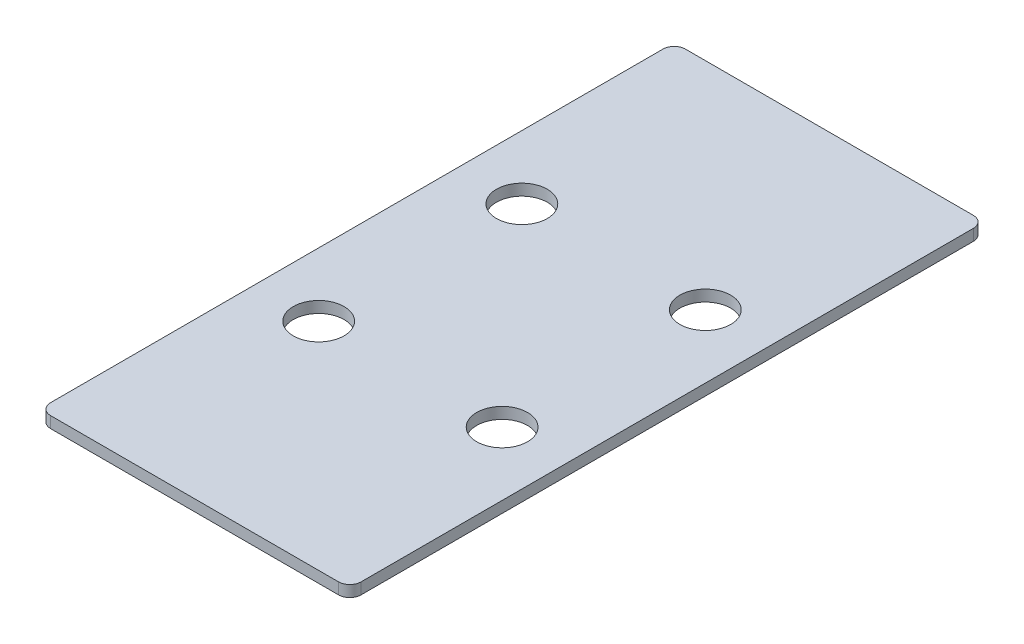
ISO-10303-21;
HEADER;
FILE_DESCRIPTION(('STEP AP214'),'2;1');
FILE_NAME('part.step','',(''),(''),'','','');
FILE_SCHEMA(('AUTOMOTIVE_DESIGN { 1 0 10303 214 1 1 1 1 }'));
ENDSEC;
DATA;
#1=APPLICATION_CONTEXT('core data for automotive mechanical design processes');
#2=APPLICATION_PROTOCOL_DEFINITION('international standard','automotive_design',2000,#1);
#3=PRODUCT_CONTEXT('',#1,'mechanical');
#4=PRODUCT('Part','Part','',(#3));
#5=PRODUCT_RELATED_PRODUCT_CATEGORY('part','',(#4));
#6=PRODUCT_DEFINITION_FORMATION('','',#4);
#7=PRODUCT_DEFINITION_CONTEXT('part definition',#1,'design');
#8=PRODUCT_DEFINITION('design','',#6,#7);
#9=PRODUCT_DEFINITION_SHAPE('','',#8);
#10=(LENGTH_UNIT() NAMED_UNIT(*) SI_UNIT(.MILLI.,.METRE.));
#11=(NAMED_UNIT(*) PLANE_ANGLE_UNIT() SI_UNIT($,.RADIAN.));
#12=(NAMED_UNIT(*) SI_UNIT($,.STERADIAN.) SOLID_ANGLE_UNIT());
#13=UNCERTAINTY_MEASURE_WITH_UNIT(LENGTH_MEASURE(1.E-05),#10,'distance_accuracy_value','');
#14=(GEOMETRIC_REPRESENTATION_CONTEXT(3) GLOBAL_UNCERTAINTY_ASSIGNED_CONTEXT((#13)) GLOBAL_UNIT_ASSIGNED_CONTEXT((#10,
#11,#12)) REPRESENTATION_CONTEXT('',''));
#15=CARTESIAN_POINT('',(0.,0.,0.));
#16=DIRECTION('',(0.,0.,1.));
#17=DIRECTION('',(1.,0.,0.));
#18=AXIS2_PLACEMENT_3D('',#15,#16,#17);
#19=CARTESIAN_POINT('',(0.,37.5,0.));
#20=DIRECTION('',(0.,-1.,0.));
#21=DIRECTION('',(0.,0.,-1.));
#22=AXIS2_PLACEMENT_3D('',#19,#20,#21);
#23=PLANE('',#22);
#24=CARTESIAN_POINT('',(-16.25,37.5,-18.));
#25=DIRECTION('',(0.,-1.,0.));
#26=DIRECTION('',(0.,0.,-1.));
#27=AXIS2_PLACEMENT_3D('',#24,#25,#26);
#28=CIRCLE('',#27,4.5);
#29=CARTESIAN_POINT('',(-16.25,37.5,-22.5));
#30=VERTEX_POINT('',#29);
#31=EDGE_CURVE('E151',#30,#30,#28,.F.);
#32=ORIENTED_EDGE('',*,*,#31,.F.);
#33=EDGE_LOOP('',(#32));
#34=FACE_BOUND('',#33,.T.);
#35=CARTESIAN_POINT('',(16.25,37.5,18.));
#36=DIRECTION('',(0.,-1.,0.));
#37=DIRECTION('',(0.,0.,-1.));
#38=AXIS2_PLACEMENT_3D('',#35,#36,#37);
#39=CIRCLE('',#38,4.5);
#40=CARTESIAN_POINT('',(16.25,37.5,13.5));
#41=VERTEX_POINT('',#40);
#42=EDGE_CURVE('E157',#41,#41,#39,.F.);
#43=ORIENTED_EDGE('',*,*,#42,.F.);
#44=EDGE_LOOP('',(#43));
#45=FACE_BOUND('',#44,.T.);
#46=DIRECTION('',(0.,0.,-1.));
#47=VECTOR('',#46,1.);
#48=CARTESIAN_POINT('',(27.5,37.5,-56.235));
#49=LINE('',#48,#47);
#50=CARTESIAN_POINT('',(27.5,37.5,54.2350000000001));
#51=VERTEX_POINT('',#50);
#52=CARTESIAN_POINT('',(27.5,37.5,-54.235));
#53=VERTEX_POINT('',#52);
#54=EDGE_CURVE('E145',#51,#53,#49,.T.);
#55=ORIENTED_EDGE('',*,*,#54,.T.);
#56=CARTESIAN_POINT('',(25.5,37.5,-54.235));
#57=DIRECTION('',(0.,-1.,0.));
#58=DIRECTION('',(0.,0.,-1.));
#59=AXIS2_PLACEMENT_3D('',#56,#57,#58);
#60=CIRCLE('',#59,2.);
#61=CARTESIAN_POINT('',(25.5,37.5,-56.235));
#62=VERTEX_POINT('',#61);
#63=EDGE_CURVE('E183',#53,#62,#60,.F.);
#64=ORIENTED_EDGE('',*,*,#63,.T.);
#65=DIRECTION('',(-1.,0.,0.));
#66=VECTOR('',#65,1.);
#67=CARTESIAN_POINT('',(27.5,37.5,-56.235));
#68=LINE('',#67,#66);
#69=CARTESIAN_POINT('',(-25.5,37.5,-56.235));
#70=VERTEX_POINT('',#69);
#71=EDGE_CURVE('E122',#62,#70,#68,.T.);
#72=ORIENTED_EDGE('',*,*,#71,.T.);
#73=CARTESIAN_POINT('',(-25.5,37.5,-54.235));
#74=DIRECTION('',(0.,-1.,0.));
#75=DIRECTION('',(0.,0.,-1.));
#76=AXIS2_PLACEMENT_3D('',#73,#74,#75);
#77=CIRCLE('',#76,2.);
#78=CARTESIAN_POINT('',(-27.5,37.5,-54.235));
#79=VERTEX_POINT('',#78);
#80=EDGE_CURVE('E181',#70,#79,#77,.F.);
#81=ORIENTED_EDGE('',*,*,#80,.T.);
#82=DIRECTION('',(0.,0.,1.));
#83=VECTOR('',#82,1.);
#84=CARTESIAN_POINT('',(-27.5,37.5,-56.235));
#85=LINE('',#84,#83);
#86=CARTESIAN_POINT('',(-27.5,37.5,54.2350000000002));
#87=VERTEX_POINT('',#86);
#88=EDGE_CURVE('E142',#79,#87,#85,.T.);
#89=ORIENTED_EDGE('',*,*,#88,.T.);
#90=CARTESIAN_POINT('',(-25.5,37.5,54.2350000000001));
#91=DIRECTION('',(0.,-1.,0.));
#92=DIRECTION('',(0.,0.,-1.));
#93=AXIS2_PLACEMENT_3D('',#90,#91,#92);
#94=CIRCLE('',#93,2.);
#95=CARTESIAN_POINT('',(-25.5,37.5,56.2350000000002));
#96=VERTEX_POINT('',#95);
#97=EDGE_CURVE('E57',#87,#96,#94,.F.);
#98=ORIENTED_EDGE('',*,*,#97,.T.);
#99=DIRECTION('',(1.,0.,0.));
#100=VECTOR('',#99,1.);
#101=CARTESIAN_POINT('',(27.5,37.5,56.2350000000001));
#102=LINE('',#101,#100);
#103=CARTESIAN_POINT('',(25.5,37.5,56.2350000000001));
#104=VERTEX_POINT('',#103);
#105=EDGE_CURVE('E139',#96,#104,#102,.T.);
#106=ORIENTED_EDGE('',*,*,#105,.T.);
#107=CARTESIAN_POINT('',(25.5,37.5,54.2350000000001));
#108=DIRECTION('',(0.,-1.,0.));
#109=DIRECTION('',(0.,0.,-1.));
#110=AXIS2_PLACEMENT_3D('',#107,#108,#109);
#111=CIRCLE('',#110,2.);
#112=EDGE_CURVE('E179',#104,#51,#111,.F.);
#113=ORIENTED_EDGE('',*,*,#112,.T.);
#114=EDGE_LOOP('',(#55,#64,#72,#81,#89,#98,#106,#113));
#115=FACE_BOUND('',#114,.T.);
#116=CARTESIAN_POINT('',(16.25,37.5,-18.));
#117=DIRECTION('',(0.,-1.,0.));
#118=DIRECTION('',(0.,0.,-1.));
#119=AXIS2_PLACEMENT_3D('',#116,#117,#118);
#120=CIRCLE('',#119,4.5);
#121=CARTESIAN_POINT('',(16.25,37.5,-22.5));
#122=VERTEX_POINT('',#121);
#123=EDGE_CURVE('E154',#122,#122,#120,.F.);
#124=ORIENTED_EDGE('',*,*,#123,.F.);
#125=EDGE_LOOP('',(#124));
#126=FACE_BOUND('',#125,.T.);
#127=CARTESIAN_POINT('',(-16.25,37.5,18.0000000000001));
#128=DIRECTION('',(0.,-1.,0.));
#129=DIRECTION('',(0.,0.,-1.));
#130=AXIS2_PLACEMENT_3D('',#127,#128,#129);
#131=CIRCLE('',#130,4.5);
#132=CARTESIAN_POINT('',(-16.25,37.5,13.5000000000001));
#133=VERTEX_POINT('',#132);
#134=EDGE_CURVE('E148',#133,#133,#131,.F.);
#135=ORIENTED_EDGE('',*,*,#134,.F.);
#136=EDGE_LOOP('',(#135));
#137=FACE_BOUND('',#136,.T.);
#138=ADVANCED_FACE('F37',(#34,#45,#115,#126,#137),#23,.F.);
#139=CARTESIAN_POINT('',(0.,35.5,0.));
#140=DIRECTION('',(0.,-1.,0.));
#141=DIRECTION('',(0.,0.,-1.));
#142=AXIS2_PLACEMENT_3D('',#139,#140,#141);
#143=PLANE('',#142);
#144=DIRECTION('',(-1.,0.,0.));
#145=VECTOR('',#144,1.);
#146=CARTESIAN_POINT('',(27.5,35.5,-56.235));
#147=LINE('',#146,#145);
#148=CARTESIAN_POINT('',(25.5,35.5,-56.235));
#149=VERTEX_POINT('',#148);
#150=CARTESIAN_POINT('',(-25.5,35.5,-56.235));
#151=VERTEX_POINT('',#150);
#152=EDGE_CURVE('E119',#149,#151,#147,.T.);
#153=ORIENTED_EDGE('',*,*,#152,.F.);
#154=CARTESIAN_POINT('',(25.5,35.5,-54.235));
#155=DIRECTION('',(0.,-1.,0.));
#156=DIRECTION('',(0.,0.,-1.));
#157=AXIS2_PLACEMENT_3D('',#154,#155,#156);
#158=CIRCLE('',#157,2.);
#159=CARTESIAN_POINT('',(27.5,35.5,-54.235));
#160=VERTEX_POINT('',#159);
#161=EDGE_CURVE('E102',#149,#160,#158,.T.);
#162=ORIENTED_EDGE('',*,*,#161,.T.);
#163=DIRECTION('',(0.,0.,-1.));
#164=VECTOR('',#163,1.);
#165=CARTESIAN_POINT('',(27.5,35.5,-56.235));
#166=LINE('',#165,#164);
#167=CARTESIAN_POINT('',(27.5,35.5,54.2350000000001));
#168=VERTEX_POINT('',#167);
#169=EDGE_CURVE('E130',#168,#160,#166,.T.);
#170=ORIENTED_EDGE('',*,*,#169,.F.);
#171=CARTESIAN_POINT('',(25.5,35.5,54.2350000000001));
#172=DIRECTION('',(0.,-1.,0.));
#173=DIRECTION('',(0.,0.,-1.));
#174=AXIS2_PLACEMENT_3D('',#171,#172,#173);
#175=CIRCLE('',#174,2.);
#176=CARTESIAN_POINT('',(25.5,35.5,56.2350000000001));
#177=VERTEX_POINT('',#176);
#178=EDGE_CURVE('E172',#168,#177,#175,.T.);
#179=ORIENTED_EDGE('',*,*,#178,.T.);
#180=DIRECTION('',(1.,0.,0.));
#181=VECTOR('',#180,1.);
#182=CARTESIAN_POINT('',(27.5,35.5,56.2350000000001));
#183=LINE('',#182,#181);
#184=CARTESIAN_POINT('',(-25.5,35.5,56.2350000000002));
#185=VERTEX_POINT('',#184);
#186=EDGE_CURVE('E133',#185,#177,#183,.T.);
#187=ORIENTED_EDGE('',*,*,#186,.F.);
#188=CARTESIAN_POINT('',(-25.5,35.5,54.2350000000001));
#189=DIRECTION('',(0.,-1.,0.));
#190=DIRECTION('',(0.,0.,-1.));
#191=AXIS2_PLACEMENT_3D('',#188,#189,#190);
#192=CIRCLE('',#191,2.);
#193=CARTESIAN_POINT('',(-27.5,35.5,54.2350000000002));
#194=VERTEX_POINT('',#193);
#195=EDGE_CURVE('E123',#185,#194,#192,.T.);
#196=ORIENTED_EDGE('',*,*,#195,.T.);
#197=DIRECTION('',(0.,0.,1.));
#198=VECTOR('',#197,1.);
#199=CARTESIAN_POINT('',(-27.5,35.5,-56.235));
#200=LINE('',#199,#198);
#201=CARTESIAN_POINT('',(-27.5,35.5,-54.235));
#202=VERTEX_POINT('',#201);
#203=EDGE_CURVE('E129',#202,#194,#200,.T.);
#204=ORIENTED_EDGE('',*,*,#203,.F.);
#205=CARTESIAN_POINT('',(-25.5,35.5,-54.235));
#206=DIRECTION('',(0.,-1.,0.));
#207=DIRECTION('',(0.,0.,-1.));
#208=AXIS2_PLACEMENT_3D('',#205,#206,#207);
#209=CIRCLE('',#208,2.);
#210=EDGE_CURVE('E113',#202,#151,#209,.T.);
#211=ORIENTED_EDGE('',*,*,#210,.T.);
#212=EDGE_LOOP('',(#153,#162,#170,#179,#187,#196,#204,#211));
#213=FACE_BOUND('',#212,.T.);
#214=CARTESIAN_POINT('',(16.25,35.5,18.));
#215=DIRECTION('',(0.,1.,0.));
#216=DIRECTION('',(0.0774921052081773,0.,-0.996992965687524));
#217=AXIS2_PLACEMENT_3D('',#214,#215,#216);
#218=CIRCLE('',#217,4.5);
#219=CARTESIAN_POINT('',(16.5987144734368,35.5,13.5135316544062));
#220=VERTEX_POINT('',#219);
#221=EDGE_CURVE('E135',#220,#220,#218,.T.);
#222=ORIENTED_EDGE('',*,*,#221,.T.);
#223=EDGE_LOOP('',(#222));
#224=FACE_BOUND('',#223,.T.);
#225=CARTESIAN_POINT('',(16.25,35.5000000000001,-18.));
#226=DIRECTION('',(0.,1.,0.));
#227=DIRECTION('',(-0.107426511793893,0.,0.994213027758034));
#228=AXIS2_PLACEMENT_3D('',#225,#226,#227);
#229=CIRCLE('',#228,4.5);
#230=CARTESIAN_POINT('',(15.7665806969275,35.5000000000001,-13.5260413750888));
#231=VERTEX_POINT('',#230);
#232=EDGE_CURVE('E162',#231,#231,#229,.T.);
#233=ORIENTED_EDGE('',*,*,#232,.T.);
#234=EDGE_LOOP('',(#233));
#235=FACE_BOUND('',#234,.T.);
#236=CARTESIAN_POINT('',(-16.25,35.5,-18.));
#237=DIRECTION('',(0.,1.,0.));
#238=DIRECTION('',(-0.446739389266582,0.,0.89466413702446));
#239=AXIS2_PLACEMENT_3D('',#236,#237,#238);
#240=CIRCLE('',#239,4.5);
#241=CARTESIAN_POINT('',(-18.2603272516996,35.5,-13.9740113833899));
#242=VERTEX_POINT('',#241);
#243=EDGE_CURVE('E163',#242,#242,#240,.T.);
#244=ORIENTED_EDGE('',*,*,#243,.T.);
#245=EDGE_LOOP('',(#244));
#246=FACE_BOUND('',#245,.T.);
#247=CARTESIAN_POINT('',(-16.25,35.5,18.0000000000001));
#248=DIRECTION('',(0.,1.,0.));
#249=DIRECTION('',(0.993376810254435,0.,-0.114902188180747));
#250=AXIS2_PLACEMENT_3D('',#247,#248,#249);
#251=CIRCLE('',#250,4.5);
#252=CARTESIAN_POINT('',(-11.779804353855,35.5,17.4829401531867));
#253=VERTEX_POINT('',#252);
#254=EDGE_CURVE('E141',#253,#253,#251,.T.);
#255=ORIENTED_EDGE('',*,*,#254,.T.);
#256=EDGE_LOOP('',(#255));
#257=FACE_BOUND('',#256,.T.);
#258=ADVANCED_FACE('F126',(#213,#224,#235,#246,#257),#143,.T.);
#259=CARTESIAN_POINT('',(27.5,37.5,-56.235));
#260=DIRECTION('',(-1.,0.,0.));
#261=DIRECTION('',(0.,0.,1.));
#262=AXIS2_PLACEMENT_3D('',#259,#260,#261);
#263=PLANE('',#262);
#264=ORIENTED_EDGE('',*,*,#169,.T.);
#265=DIRECTION('',(0.,-1.,0.));
#266=VECTOR('',#265,1.);
#267=CARTESIAN_POINT('',(27.5,37.5,-54.235));
#268=LINE('',#267,#266);
#269=EDGE_CURVE('E107',#160,#53,#268,.F.);
#270=ORIENTED_EDGE('',*,*,#269,.T.);
#271=ORIENTED_EDGE('',*,*,#54,.F.);
#272=DIRECTION('',(0.,-1.,0.));
#273=VECTOR('',#272,1.);
#274=CARTESIAN_POINT('',(27.5,37.5,54.2350000000001));
#275=LINE('',#274,#273);
#276=EDGE_CURVE('E112',#51,#168,#275,.T.);
#277=ORIENTED_EDGE('',*,*,#276,.T.);
#278=EDGE_LOOP('',(#264,#270,#271,#277));
#279=FACE_BOUND('',#278,.T.);
#280=ADVANCED_FACE('F200',(#279),#263,.F.);
#281=CARTESIAN_POINT('',(27.5,37.5,-56.235));
#282=DIRECTION('',(0.,0.,1.));
#283=DIRECTION('',(0.,-1.,0.));
#284=AXIS2_PLACEMENT_3D('',#281,#282,#283);
#285=PLANE('',#284);
#286=ORIENTED_EDGE('',*,*,#71,.F.);
#287=DIRECTION('',(0.,-1.,0.));
#288=VECTOR('',#287,1.);
#289=CARTESIAN_POINT('',(25.5,37.5,-56.235));
#290=LINE('',#289,#288);
#291=EDGE_CURVE('E106',#62,#149,#290,.T.);
#292=ORIENTED_EDGE('',*,*,#291,.T.);
#293=ORIENTED_EDGE('',*,*,#152,.T.);
#294=DIRECTION('',(0.,-1.,0.));
#295=VECTOR('',#294,1.);
#296=CARTESIAN_POINT('',(-25.5,37.5,-56.235));
#297=LINE('',#296,#295);
#298=EDGE_CURVE('E124',#151,#70,#297,.F.);
#299=ORIENTED_EDGE('',*,*,#298,.T.);
#300=EDGE_LOOP('',(#286,#292,#293,#299));
#301=FACE_BOUND('',#300,.T.);
#302=ADVANCED_FACE('F118',(#301),#285,.F.);
#303=CARTESIAN_POINT('',(-27.5,37.5,-56.235));
#304=DIRECTION('',(1.,0.,0.));
#305=DIRECTION('',(0.,0.,-1.));
#306=AXIS2_PLACEMENT_3D('',#303,#304,#305);
#307=PLANE('',#306);
#308=ORIENTED_EDGE('',*,*,#88,.F.);
#309=DIRECTION('',(0.,-1.,0.));
#310=VECTOR('',#309,1.);
#311=CARTESIAN_POINT('',(-27.5,37.5,-54.235));
#312=LINE('',#311,#310);
#313=EDGE_CURVE('E187',#79,#202,#312,.T.);
#314=ORIENTED_EDGE('',*,*,#313,.T.);
#315=ORIENTED_EDGE('',*,*,#203,.T.);
#316=DIRECTION('',(0.,-1.,0.));
#317=VECTOR('',#316,1.);
#318=CARTESIAN_POINT('',(-27.5,37.5,54.2350000000002));
#319=LINE('',#318,#317);
#320=EDGE_CURVE('E185',#194,#87,#319,.F.);
#321=ORIENTED_EDGE('',*,*,#320,.T.);
#322=EDGE_LOOP('',(#308,#314,#315,#321));
#323=FACE_BOUND('',#322,.T.);
#324=ADVANCED_FACE('F208',(#323),#307,.F.);
#325=CARTESIAN_POINT('',(27.5,37.5,56.2350000000001));
#326=DIRECTION('',(0.,0.,-1.));
#327=DIRECTION('',(-1.,0.,0.));
#328=AXIS2_PLACEMENT_3D('',#325,#326,#327);
#329=PLANE('',#328);
#330=ORIENTED_EDGE('',*,*,#186,.T.);
#331=DIRECTION('',(0.,-1.,0.));
#332=VECTOR('',#331,1.);
#333=CARTESIAN_POINT('',(25.5,37.5,56.2350000000001));
#334=LINE('',#333,#332);
#335=EDGE_CURVE('E11',#177,#104,#334,.F.);
#336=ORIENTED_EDGE('',*,*,#335,.T.);
#337=ORIENTED_EDGE('',*,*,#105,.F.);
#338=DIRECTION('',(0.,-1.,0.));
#339=VECTOR('',#338,1.);
#340=CARTESIAN_POINT('',(-25.5,37.5,56.2350000000002));
#341=LINE('',#340,#339);
#342=EDGE_CURVE('E45',#96,#185,#341,.T.);
#343=ORIENTED_EDGE('',*,*,#342,.T.);
#344=EDGE_LOOP('',(#330,#336,#337,#343));
#345=FACE_BOUND('',#344,.T.);
#346=ADVANCED_FACE('F192',(#345),#329,.F.);
#347=CARTESIAN_POINT('',(16.25,38.,18.));
#348=DIRECTION('',(0.,-1.,0.));
#349=DIRECTION('',(-0.0774921052081773,0.,0.996992965687524));
#350=AXIS2_PLACEMENT_3D('',#347,#348,#349);
#351=CYLINDRICAL_SURFACE('',#350,4.5);
#352=ORIENTED_EDGE('',*,*,#221,.F.);
#353=EDGE_LOOP('',(#352));
#354=FACE_BOUND('',#353,.T.);
#355=ORIENTED_EDGE('',*,*,#42,.T.);
#356=EDGE_LOOP('',(#355));
#357=FACE_BOUND('',#356,.T.);
#358=ADVANCED_FACE('F282',(#354,#357),#351,.F.);
#359=CARTESIAN_POINT('',(16.25,38.0000000000001,-18.));
#360=DIRECTION('',(0.,-1.,0.));
#361=DIRECTION('',(0.107426511793893,0.,-0.994213027758034));
#362=AXIS2_PLACEMENT_3D('',#359,#360,#361);
#363=CYLINDRICAL_SURFACE('',#362,4.5);
#364=ORIENTED_EDGE('',*,*,#232,.F.);
#365=EDGE_LOOP('',(#364));
#366=FACE_BOUND('',#365,.T.);
#367=ORIENTED_EDGE('',*,*,#123,.T.);
#368=EDGE_LOOP('',(#367));
#369=FACE_BOUND('',#368,.T.);
#370=ADVANCED_FACE('F271',(#366,#369),#363,.F.);
#371=CARTESIAN_POINT('',(-16.25,38.,-18.));
#372=DIRECTION('',(0.,-1.,0.));
#373=DIRECTION('',(0.446739389266582,0.,-0.89466413702446));
#374=AXIS2_PLACEMENT_3D('',#371,#372,#373);
#375=CYLINDRICAL_SURFACE('',#374,4.5);
#376=ORIENTED_EDGE('',*,*,#243,.F.);
#377=EDGE_LOOP('',(#376));
#378=FACE_BOUND('',#377,.T.);
#379=ORIENTED_EDGE('',*,*,#31,.T.);
#380=EDGE_LOOP('',(#379));
#381=FACE_BOUND('',#380,.T.);
#382=ADVANCED_FACE('F260',(#378,#381),#375,.F.);
#383=CARTESIAN_POINT('',(-16.25,38.,18.0000000000001));
#384=DIRECTION('',(0.,-1.,0.));
#385=DIRECTION('',(-0.993376810254435,0.,0.114902188180747));
#386=AXIS2_PLACEMENT_3D('',#383,#384,#385);
#387=CYLINDRICAL_SURFACE('',#386,4.5);
#388=ORIENTED_EDGE('',*,*,#254,.F.);
#389=EDGE_LOOP('',(#388));
#390=FACE_BOUND('',#389,.T.);
#391=ORIENTED_EDGE('',*,*,#134,.T.);
#392=EDGE_LOOP('',(#391));
#393=FACE_BOUND('',#392,.T.);
#394=ADVANCED_FACE('F228',(#390,#393),#387,.F.);
#395=CARTESIAN_POINT('',(25.5,37.5,-54.235));
#396=DIRECTION('',(0.,-1.,0.));
#397=DIRECTION('',(0.,0.,-1.));
#398=AXIS2_PLACEMENT_3D('',#395,#396,#397);
#399=CYLINDRICAL_SURFACE('',#398,2.);
#400=ORIENTED_EDGE('',*,*,#63,.F.);
#401=ORIENTED_EDGE('',*,*,#269,.F.);
#402=ORIENTED_EDGE('',*,*,#161,.F.);
#403=ORIENTED_EDGE('',*,*,#291,.F.);
#404=EDGE_LOOP('',(#400,#401,#402,#403));
#405=FACE_BOUND('',#404,.T.);
#406=ADVANCED_FACE('F105',(#405),#399,.T.);
#407=CARTESIAN_POINT('',(-25.5,37.5,-54.235));
#408=DIRECTION('',(0.,-1.,0.));
#409=DIRECTION('',(0.,0.,-1.));
#410=AXIS2_PLACEMENT_3D('',#407,#408,#409);
#411=CYLINDRICAL_SURFACE('',#410,2.);
#412=ORIENTED_EDGE('',*,*,#80,.F.);
#413=ORIENTED_EDGE('',*,*,#298,.F.);
#414=ORIENTED_EDGE('',*,*,#210,.F.);
#415=ORIENTED_EDGE('',*,*,#313,.F.);
#416=EDGE_LOOP('',(#412,#413,#414,#415));
#417=FACE_BOUND('',#416,.T.);
#418=ADVANCED_FACE('F206',(#417),#411,.T.);
#419=CARTESIAN_POINT('',(25.5,37.5,54.2350000000001));
#420=DIRECTION('',(0.,-1.,0.));
#421=DIRECTION('',(0.,0.,-1.));
#422=AXIS2_PLACEMENT_3D('',#419,#420,#421);
#423=CYLINDRICAL_SURFACE('',#422,2.);
#424=ORIENTED_EDGE('',*,*,#112,.F.);
#425=ORIENTED_EDGE('',*,*,#335,.F.);
#426=ORIENTED_EDGE('',*,*,#178,.F.);
#427=ORIENTED_EDGE('',*,*,#276,.F.);
#428=EDGE_LOOP('',(#424,#425,#426,#427));
#429=FACE_BOUND('',#428,.T.);
#430=ADVANCED_FACE('F197',(#429),#423,.T.);
#431=CARTESIAN_POINT('',(-25.5,37.5,54.2350000000001));
#432=DIRECTION('',(0.,-1.,0.));
#433=DIRECTION('',(0.,0.,-1.));
#434=AXIS2_PLACEMENT_3D('',#431,#432,#433);
#435=CYLINDRICAL_SURFACE('',#434,2.);
#436=ORIENTED_EDGE('',*,*,#97,.F.);
#437=ORIENTED_EDGE('',*,*,#320,.F.);
#438=ORIENTED_EDGE('',*,*,#195,.F.);
#439=ORIENTED_EDGE('',*,*,#342,.F.);
#440=EDGE_LOOP('',(#436,#437,#438,#439));
#441=FACE_BOUND('',#440,.T.);
#442=ADVANCED_FACE('F39',(#441),#435,.T.);
#443=CLOSED_SHELL('',(#138,#258,#280,#302,#324,#346,#358,#370,#382,#394,#406,#418,#430,#442));
#444=MANIFOLD_SOLID_BREP('B2',#443);
#445=ADVANCED_BREP_SHAPE_REPRESENTATION('',(#18,#444),#14);
#446=SHAPE_DEFINITION_REPRESENTATION(#9,#445);
ENDSEC;
END-ISO-10303-21;
